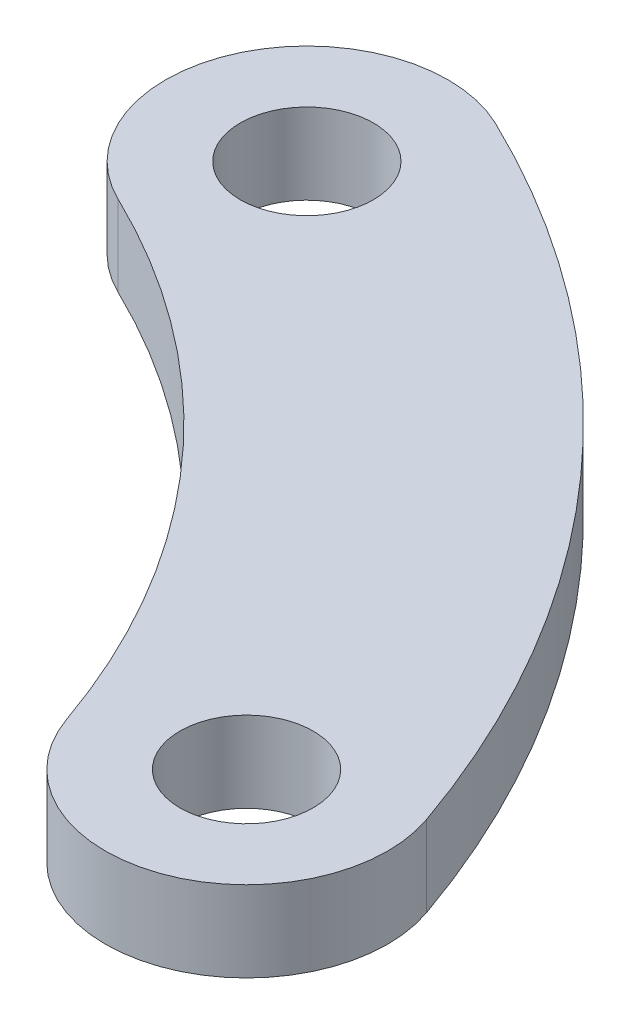
ISO-10303-21;
HEADER;
FILE_DESCRIPTION(('STEP AP214'),'2;1');
FILE_NAME('part.step','',(''),(''),'','','');
FILE_SCHEMA(('AUTOMOTIVE_DESIGN { 1 0 10303 214 1 1 1 1 }'));
ENDSEC;
DATA;
#1=APPLICATION_CONTEXT('core data for automotive mechanical design processes');
#2=APPLICATION_PROTOCOL_DEFINITION('international standard','automotive_design',2000,#1);
#3=PRODUCT_CONTEXT('',#1,'mechanical');
#4=PRODUCT('Part','Part','',(#3));
#5=PRODUCT_RELATED_PRODUCT_CATEGORY('part','',(#4));
#6=PRODUCT_DEFINITION_FORMATION('','',#4);
#7=PRODUCT_DEFINITION_CONTEXT('part definition',#1,'design');
#8=PRODUCT_DEFINITION('design','',#6,#7);
#9=PRODUCT_DEFINITION_SHAPE('','',#8);
#10=(LENGTH_UNIT() NAMED_UNIT(*) SI_UNIT(.MILLI.,.METRE.));
#11=(NAMED_UNIT(*) PLANE_ANGLE_UNIT() SI_UNIT($,.RADIAN.));
#12=(NAMED_UNIT(*) SI_UNIT($,.STERADIAN.) SOLID_ANGLE_UNIT());
#13=UNCERTAINTY_MEASURE_WITH_UNIT(LENGTH_MEASURE(1.E-05),#10,'distance_accuracy_value','');
#14=(GEOMETRIC_REPRESENTATION_CONTEXT(3) GLOBAL_UNCERTAINTY_ASSIGNED_CONTEXT((#13)) GLOBAL_UNIT_ASSIGNED_CONTEXT((#10,
#11,#12)) REPRESENTATION_CONTEXT('',''));
#15=CARTESIAN_POINT('',(0.,0.,0.));
#16=DIRECTION('',(0.,0.,1.));
#17=DIRECTION('',(1.,0.,0.));
#18=AXIS2_PLACEMENT_3D('',#15,#16,#17);
#19=CARTESIAN_POINT('',(11.4017185215984,4.,-3.97573134834832));
#20=DIRECTION('',(0.,1.,0.));
#21=DIRECTION('',(0.,0.,1.));
#22=AXIS2_PLACEMENT_3D('',#19,#20,#21);
#23=PLANE('',#22);
#24=CARTESIAN_POINT('',(10.5019317744189,4.,-21.7469981607911));
#25=DIRECTION('',(0.,1.,0.));
#26=DIRECTION('',(0.,0.,1.));
#27=AXIS2_PLACEMENT_3D('',#24,#25,#26);
#28=CIRCLE('',#27,1.65);
#29=CARTESIAN_POINT('',(10.5019317744189,4.,-20.0969981607911));
#30=VERTEX_POINT('',#29);
#31=EDGE_CURVE('E100',#30,#30,#28,.T.);
#32=ORIENTED_EDGE('',*,*,#31,.F.);
#33=EDGE_LOOP('',(#32));
#34=FACE_BOUND('',#33,.T.);
#35=CARTESIAN_POINT('',(22.8034370431968,4.,-7.95146269669664));
#36=DIRECTION('',(0.,1.,0.));
#37=DIRECTION('',(0.,0.,1.));
#38=AXIS2_PLACEMENT_3D('',#35,#36,#37);
#39=CIRCLE('',#38,3.5);
#40=CARTESIAN_POINT('',(19.4985910949074,4.,-6.79907679862466));
#41=VERTEX_POINT('',#40);
#42=CARTESIAN_POINT('',(26.1082829914862,4.,-9.10384859476862));
#43=VERTEX_POINT('',#42);
#44=EDGE_CURVE('E85',#41,#43,#39,.T.);
#45=ORIENTED_EDGE('',*,*,#44,.T.);
#46=CARTESIAN_POINT('',(0.,4.,0.));
#47=DIRECTION('',(0.,1.,0.));
#48=DIRECTION('',(0.,0.,1.));
#49=AXIS2_PLACEMENT_3D('',#46,#47,#48);
#50=CIRCLE('',#49,27.65);
#51=CARTESIAN_POINT('',(12.0239508721608,4.,-24.8987370246738));
#52=VERTEX_POINT('',#51);
#53=EDGE_CURVE('E80',#43,#52,#50,.T.);
#54=ORIENTED_EDGE('',*,*,#53,.T.);
#55=CARTESIAN_POINT('',(10.5019317744189,4.,-21.7469981607911));
#56=DIRECTION('',(0.,1.,0.));
#57=DIRECTION('',(0.,0.,1.));
#58=AXIS2_PLACEMENT_3D('',#55,#56,#57);
#59=CIRCLE('',#58,3.5);
#60=CARTESIAN_POINT('',(8.97991267667702,4.,-18.5952592969083));
#61=VERTEX_POINT('',#60);
#62=EDGE_CURVE('E83',#52,#61,#59,.T.);
#63=ORIENTED_EDGE('',*,*,#62,.T.);
#64=CARTESIAN_POINT('',(0.,4.,0.));
#65=DIRECTION('',(0.,-1.,0.));
#66=DIRECTION('',(0.,0.,1.));
#67=AXIS2_PLACEMENT_3D('',#64,#65,#66);
#68=CIRCLE('',#67,20.65);
#69=EDGE_CURVE('E50',#61,#41,#68,.T.);
#70=ORIENTED_EDGE('',*,*,#69,.T.);
#71=EDGE_LOOP('',(#45,#54,#63,#70));
#72=FACE_BOUND('',#71,.T.);
#73=CARTESIAN_POINT('',(22.8034370431968,4.,-7.95146269669664));
#74=DIRECTION('',(0.,1.,0.));
#75=DIRECTION('',(0.,0.,1.));
#76=AXIS2_PLACEMENT_3D('',#73,#74,#75);
#77=CIRCLE('',#76,1.65);
#78=CARTESIAN_POINT('',(22.8034370431968,4.,-6.30146269669664));
#79=VERTEX_POINT('',#78);
#80=EDGE_CURVE('E115',#79,#79,#77,.T.);
#81=ORIENTED_EDGE('',*,*,#80,.F.);
#82=EDGE_LOOP('',(#81));
#83=FACE_BOUND('',#82,.T.);
#84=ADVANCED_FACE('F33',(#34,#72,#83),#23,.T.);
#85=CARTESIAN_POINT('',(11.4017185215984,2.,-3.97573134834832));
#86=DIRECTION('',(0.,1.,0.));
#87=DIRECTION('',(0.,0.,1.));
#88=AXIS2_PLACEMENT_3D('',#85,#86,#87);
#89=PLANE('',#88);
#90=CARTESIAN_POINT('',(22.8034370431968,2.,-7.95146269669664));
#91=DIRECTION('',(0.,1.,0.));
#92=DIRECTION('',(0.,0.,1.));
#93=AXIS2_PLACEMENT_3D('',#90,#91,#92);
#94=CIRCLE('',#93,3.5);
#95=CARTESIAN_POINT('',(19.4985910949074,2.,-6.79907679862466));
#96=VERTEX_POINT('',#95);
#97=CARTESIAN_POINT('',(26.1082829914862,2.,-9.10384859476862));
#98=VERTEX_POINT('',#97);
#99=EDGE_CURVE('E97',#96,#98,#94,.T.);
#100=ORIENTED_EDGE('',*,*,#99,.F.);
#101=CARTESIAN_POINT('',(0.,2.,0.));
#102=DIRECTION('',(0.,-1.,0.));
#103=DIRECTION('',(0.,0.,1.));
#104=AXIS2_PLACEMENT_3D('',#101,#102,#103);
#105=CIRCLE('',#104,20.65);
#106=CARTESIAN_POINT('',(8.97991267667702,2.,-18.5952592969083));
#107=VERTEX_POINT('',#106);
#108=EDGE_CURVE('E73',#107,#96,#105,.T.);
#109=ORIENTED_EDGE('',*,*,#108,.F.);
#110=CARTESIAN_POINT('',(10.5019317744189,2.,-21.7469981607911));
#111=DIRECTION('',(0.,1.,0.));
#112=DIRECTION('',(0.,0.,1.));
#113=AXIS2_PLACEMENT_3D('',#110,#111,#112);
#114=CIRCLE('',#113,3.5);
#115=CARTESIAN_POINT('',(12.0239508721608,2.,-24.8987370246738));
#116=VERTEX_POINT('',#115);
#117=EDGE_CURVE('E67',#116,#107,#114,.T.);
#118=ORIENTED_EDGE('',*,*,#117,.F.);
#119=CARTESIAN_POINT('',(0.,2.,0.));
#120=DIRECTION('',(0.,1.,0.));
#121=DIRECTION('',(0.,0.,1.));
#122=AXIS2_PLACEMENT_3D('',#119,#120,#121);
#123=CIRCLE('',#122,27.65);
#124=EDGE_CURVE('E89',#98,#116,#123,.T.);
#125=ORIENTED_EDGE('',*,*,#124,.F.);
#126=EDGE_LOOP('',(#100,#109,#118,#125));
#127=FACE_BOUND('',#126,.T.);
#128=CARTESIAN_POINT('',(10.5019317744189,2.,-21.7469981607911));
#129=DIRECTION('',(0.,1.,0.));
#130=DIRECTION('',(0.,0.,1.));
#131=AXIS2_PLACEMENT_3D('',#128,#129,#130);
#132=CIRCLE('',#131,1.65);
#133=CARTESIAN_POINT('',(10.5019317744189,2.,-20.0969981607911));
#134=VERTEX_POINT('',#133);
#135=EDGE_CURVE('E112',#134,#134,#132,.T.);
#136=ORIENTED_EDGE('',*,*,#135,.T.);
#137=EDGE_LOOP('',(#136));
#138=FACE_BOUND('',#137,.T.);
#139=CARTESIAN_POINT('',(22.8034370431968,2.,-7.95146269669664));
#140=DIRECTION('',(0.,1.,0.));
#141=DIRECTION('',(0.,0.,1.));
#142=AXIS2_PLACEMENT_3D('',#139,#140,#141);
#143=CIRCLE('',#142,1.65);
#144=CARTESIAN_POINT('',(22.8034370431968,2.,-6.30146269669664));
#145=VERTEX_POINT('',#144);
#146=EDGE_CURVE('E118',#145,#145,#143,.T.);
#147=ORIENTED_EDGE('',*,*,#146,.T.);
#148=EDGE_LOOP('',(#147));
#149=FACE_BOUND('',#148,.T.);
#150=ADVANCED_FACE('F108',(#127,#138,#149),#89,.F.);
#151=CARTESIAN_POINT('',(22.8034370431968,4.,-7.95146269669664));
#152=DIRECTION('',(0.,-1.,0.));
#153=DIRECTION('',(0.,0.,-1.));
#154=AXIS2_PLACEMENT_3D('',#151,#152,#153);
#155=CYLINDRICAL_SURFACE('',#154,3.5);
#156=ORIENTED_EDGE('',*,*,#99,.T.);
#157=DIRECTION('',(0.,-1.,0.));
#158=VECTOR('',#157,1.);
#159=CARTESIAN_POINT('',(26.1082829914862,4.,-9.10384859476862));
#160=LINE('',#159,#158);
#161=EDGE_CURVE('E11',#43,#98,#160,.T.);
#162=ORIENTED_EDGE('',*,*,#161,.F.);
#163=ORIENTED_EDGE('',*,*,#44,.F.);
#164=DIRECTION('',(0.,-1.,0.));
#165=VECTOR('',#164,1.);
#166=CARTESIAN_POINT('',(19.4985910949074,4.,-6.79907679862466));
#167=LINE('',#166,#165);
#168=EDGE_CURVE('E93',#41,#96,#167,.T.);
#169=ORIENTED_EDGE('',*,*,#168,.T.);
#170=EDGE_LOOP('',(#156,#162,#163,#169));
#171=FACE_BOUND('',#170,.T.);
#172=ADVANCED_FACE('F35',(#171),#155,.T.);
#173=CARTESIAN_POINT('',(0.,4.,0.));
#174=DIRECTION('',(0.,-1.,0.));
#175=DIRECTION('',(0.,0.,-1.));
#176=AXIS2_PLACEMENT_3D('',#173,#174,#175);
#177=CYLINDRICAL_SURFACE('',#176,27.65);
#178=ORIENTED_EDGE('',*,*,#124,.T.);
#179=DIRECTION('',(0.,-1.,0.));
#180=VECTOR('',#179,1.);
#181=CARTESIAN_POINT('',(12.0239508721608,4.,-24.8987370246738));
#182=LINE('',#181,#180);
#183=EDGE_CURVE('E42',#52,#116,#182,.T.);
#184=ORIENTED_EDGE('',*,*,#183,.F.);
#185=ORIENTED_EDGE('',*,*,#53,.F.);
#186=ORIENTED_EDGE('',*,*,#161,.T.);
#187=EDGE_LOOP('',(#178,#184,#185,#186));
#188=FACE_BOUND('',#187,.T.);
#189=ADVANCED_FACE('F88',(#188),#177,.T.);
#190=CARTESIAN_POINT('',(10.5019317744189,4.,-21.7469981607911));
#191=DIRECTION('',(0.,-1.,0.));
#192=DIRECTION('',(0.,0.,-1.));
#193=AXIS2_PLACEMENT_3D('',#190,#191,#192);
#194=CYLINDRICAL_SURFACE('',#193,3.5);
#195=ORIENTED_EDGE('',*,*,#117,.T.);
#196=DIRECTION('',(0.,-1.,0.));
#197=VECTOR('',#196,1.);
#198=CARTESIAN_POINT('',(8.97991267667702,4.,-18.5952592969083));
#199=LINE('',#198,#197);
#200=EDGE_CURVE('E90',#61,#107,#199,.T.);
#201=ORIENTED_EDGE('',*,*,#200,.F.);
#202=ORIENTED_EDGE('',*,*,#62,.F.);
#203=ORIENTED_EDGE('',*,*,#183,.T.);
#204=EDGE_LOOP('',(#195,#201,#202,#203));
#205=FACE_BOUND('',#204,.T.);
#206=ADVANCED_FACE('F91',(#205),#194,.T.);
#207=CARTESIAN_POINT('',(0.,4.,0.));
#208=DIRECTION('',(0.,-1.,0.));
#209=DIRECTION('',(0.,0.,-1.));
#210=AXIS2_PLACEMENT_3D('',#207,#208,#209);
#211=CYLINDRICAL_SURFACE('',#210,20.65);
#212=ORIENTED_EDGE('',*,*,#108,.T.);
#213=ORIENTED_EDGE('',*,*,#168,.F.);
#214=ORIENTED_EDGE('',*,*,#69,.F.);
#215=ORIENTED_EDGE('',*,*,#200,.T.);
#216=EDGE_LOOP('',(#212,#213,#214,#215));
#217=FACE_BOUND('',#216,.T.);
#218=ADVANCED_FACE('F105',(#217),#211,.F.);
#219=CARTESIAN_POINT('',(10.5019317744189,4.,-21.7469981607911));
#220=DIRECTION('',(0.,-1.,0.));
#221=DIRECTION('',(0.,0.,-1.));
#222=AXIS2_PLACEMENT_3D('',#219,#220,#221);
#223=CYLINDRICAL_SURFACE('',#222,1.65);
#224=ORIENTED_EDGE('',*,*,#31,.T.);
#225=EDGE_LOOP('',(#224));
#226=FACE_BOUND('',#225,.T.);
#227=ORIENTED_EDGE('',*,*,#135,.F.);
#228=EDGE_LOOP('',(#227));
#229=FACE_BOUND('',#228,.T.);
#230=ADVANCED_FACE('F135',(#226,#229),#223,.F.);
#231=CARTESIAN_POINT('',(22.8034370431968,4.,-7.95146269669664));
#232=DIRECTION('',(0.,-1.,0.));
#233=DIRECTION('',(0.,0.,-1.));
#234=AXIS2_PLACEMENT_3D('',#231,#232,#233);
#235=CYLINDRICAL_SURFACE('',#234,1.65);
#236=ORIENTED_EDGE('',*,*,#80,.T.);
#237=EDGE_LOOP('',(#236));
#238=FACE_BOUND('',#237,.T.);
#239=ORIENTED_EDGE('',*,*,#146,.F.);
#240=EDGE_LOOP('',(#239));
#241=FACE_BOUND('',#240,.T.);
#242=ADVANCED_FACE('F124',(#238,#241),#235,.F.);
#243=CLOSED_SHELL('',(#84,#150,#172,#189,#206,#218,#230,#242));
#244=MANIFOLD_SOLID_BREP('B2',#243);
#245=ADVANCED_BREP_SHAPE_REPRESENTATION('',(#18,#244),#14);
#246=SHAPE_DEFINITION_REPRESENTATION(#9,#245);
ENDSEC;
END-ISO-10303-21;
